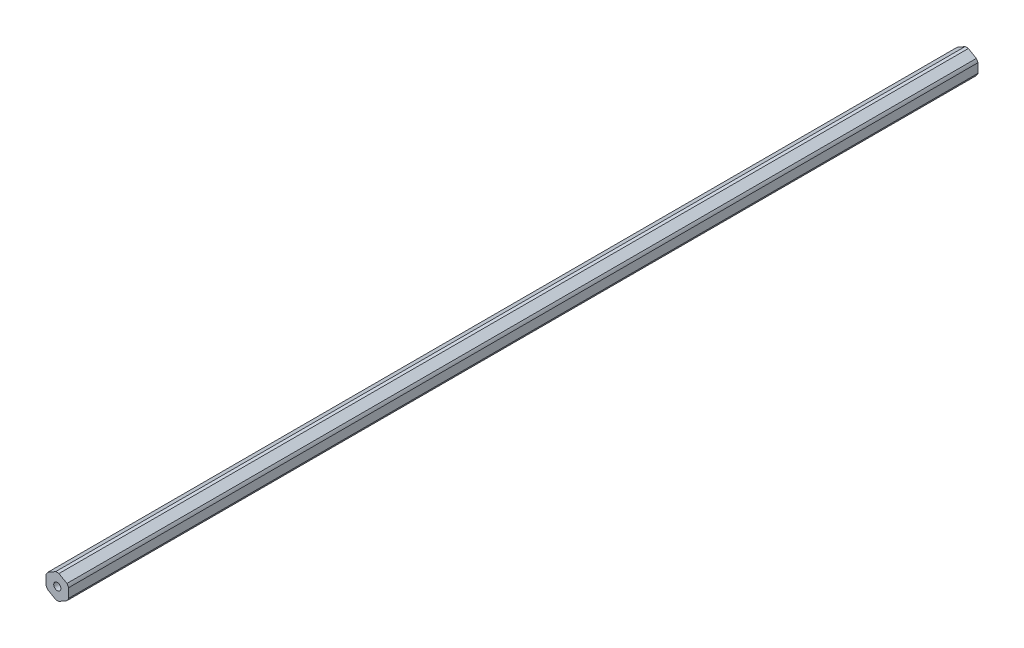
ISO-10303-21;
HEADER;
FILE_DESCRIPTION(('STEP AP214'),'2;1');
FILE_NAME('part.step','',(''),(''),'','','');
FILE_SCHEMA(('AUTOMOTIVE_DESIGN { 1 0 10303 214 1 1 1 1 }'));
ENDSEC;
DATA;
#1=APPLICATION_CONTEXT('core data for automotive mechanical design processes');
#2=APPLICATION_PROTOCOL_DEFINITION('international standard','automotive_design',2000,#1);
#3=PRODUCT_CONTEXT('',#1,'mechanical');
#4=PRODUCT('Part','Part','',(#3));
#5=PRODUCT_RELATED_PRODUCT_CATEGORY('part','',(#4));
#6=PRODUCT_DEFINITION_FORMATION('','',#4);
#7=PRODUCT_DEFINITION_CONTEXT('part definition',#1,'design');
#8=PRODUCT_DEFINITION('design','',#6,#7);
#9=PRODUCT_DEFINITION_SHAPE('','',#8);
#10=(LENGTH_UNIT() NAMED_UNIT(*) SI_UNIT(.MILLI.,.METRE.));
#11=(NAMED_UNIT(*) PLANE_ANGLE_UNIT() SI_UNIT($,.RADIAN.));
#12=(NAMED_UNIT(*) SI_UNIT($,.STERADIAN.) SOLID_ANGLE_UNIT());
#13=UNCERTAINTY_MEASURE_WITH_UNIT(LENGTH_MEASURE(1.E-05),#10,'distance_accuracy_value','');
#14=(GEOMETRIC_REPRESENTATION_CONTEXT(3) GLOBAL_UNCERTAINTY_ASSIGNED_CONTEXT((#13)) GLOBAL_UNIT_ASSIGNED_CONTEXT((#10,
#11,#12)) REPRESENTATION_CONTEXT('',''));
#15=CARTESIAN_POINT('',(0.,0.,0.));
#16=DIRECTION('',(0.,0.,1.));
#17=DIRECTION('',(1.,0.,0.));
#18=AXIS2_PLACEMENT_3D('',#15,#16,#17);
#19=CARTESIAN_POINT('',(6.34999999999999,0.,255.7145));
#20=DIRECTION('',(-1.,0.,0.));
#21=DIRECTION('',(0.,-1.,0.));
#22=AXIS2_PLACEMENT_3D('',#19,#20,#21);
#23=PLANE('',#22);
#24=DIRECTION('',(0.,1.,0.));
#25=VECTOR('',#24,1.);
#26=CARTESIAN_POINT('',(6.34999999999999,0.,-255.7145));
#27=LINE('',#26,#25);
#28=CARTESIAN_POINT('',(6.35000000000002,-2.59030191290508,-255.7145));
#29=VERTEX_POINT('',#28);
#30=CARTESIAN_POINT('',(6.34999999999997,2.59030191290522,-255.7145));
#31=VERTEX_POINT('',#30);
#32=EDGE_CURVE('E173',#29,#31,#27,.T.);
#33=ORIENTED_EDGE('',*,*,#32,.T.);
#34=DIRECTION('',(0.,0.,-1.));
#35=VECTOR('',#34,1.);
#36=CARTESIAN_POINT('',(6.34999999999997,2.59030191290522,255.7145));
#37=LINE('',#36,#35);
#38=CARTESIAN_POINT('',(6.34999999999997,2.59030191290522,255.7145));
#39=VERTEX_POINT('',#38);
#40=EDGE_CURVE('E11',#39,#31,#37,.T.);
#41=ORIENTED_EDGE('',*,*,#40,.F.);
#42=DIRECTION('',(0.,1.,0.));
#43=VECTOR('',#42,1.);
#44=CARTESIAN_POINT('',(6.34999999999999,0.,255.7145));
#45=LINE('',#44,#43);
#46=CARTESIAN_POINT('',(6.35000000000002,-2.59030191290508,255.7145));
#47=VERTEX_POINT('',#46);
#48=EDGE_CURVE('E253',#47,#39,#45,.T.);
#49=ORIENTED_EDGE('',*,*,#48,.F.);
#50=DIRECTION('',(0.,0.,-1.));
#51=VECTOR('',#50,1.);
#52=CARTESIAN_POINT('',(6.35000000000002,-2.59030191290508,255.7145));
#53=LINE('',#52,#51);
#54=EDGE_CURVE('E169',#47,#29,#53,.T.);
#55=ORIENTED_EDGE('',*,*,#54,.T.);
#56=EDGE_LOOP('',(#33,#41,#49,#55));
#57=FACE_BOUND('',#56,.T.);
#58=ADVANCED_FACE('F47',(#57),#23,.F.);
#59=CARTESIAN_POINT('',(0.,0.,255.7145));
#60=DIRECTION('',(0.,0.,-1.));
#61=DIRECTION('',(-1.,0.,0.));
#62=AXIS2_PLACEMENT_3D('',#59,#60,#61);
#63=CYLINDRICAL_SURFACE('',#62,6.858);
#64=CARTESIAN_POINT('',(0.,0.,-255.7145));
#65=DIRECTION('',(0.,0.,1.));
#66=DIRECTION('',(1.,0.,0.));
#67=AXIS2_PLACEMENT_3D('',#64,#65,#66);
#68=CIRCLE('',#67,6.858);
#69=CARTESIAN_POINT('',(5.41826726004722,4.20411035757869,-255.7145));
#70=VERTEX_POINT('',#69);
#71=EDGE_CURVE('E177',#31,#70,#68,.T.);
#72=ORIENTED_EDGE('',*,*,#71,.T.);
#73=DIRECTION('',(0.,0.,-1.));
#74=VECTOR('',#73,1.);
#75=CARTESIAN_POINT('',(5.41826726004722,4.20411035757869,255.7145));
#76=LINE('',#75,#74);
#77=CARTESIAN_POINT('',(5.41826726004722,4.20411035757869,255.7145));
#78=VERTEX_POINT('',#77);
#79=EDGE_CURVE('E56',#78,#70,#76,.T.);
#80=ORIENTED_EDGE('',*,*,#79,.F.);
#81=CARTESIAN_POINT('',(0.,0.,255.7145));
#82=DIRECTION('',(0.,0.,1.));
#83=DIRECTION('',(1.,0.,0.));
#84=AXIS2_PLACEMENT_3D('',#81,#82,#83);
#85=CIRCLE('',#84,6.858);
#86=EDGE_CURVE('E119',#39,#78,#85,.T.);
#87=ORIENTED_EDGE('',*,*,#86,.F.);
#88=ORIENTED_EDGE('',*,*,#40,.T.);
#89=EDGE_LOOP('',(#72,#80,#87,#88));
#90=FACE_BOUND('',#89,.T.);
#91=ADVANCED_FACE('F297',(#90),#63,.T.);
#92=CARTESIAN_POINT('',(3.17499999999998,5.49926131403122,255.7145));
#93=DIRECTION('',(-0.499999999999995,-0.866025403784442,0.));
#94=DIRECTION('',(0.866025403784442,-0.499999999999995,0.));
#95=AXIS2_PLACEMENT_3D('',#92,#93,#94);
#96=PLANE('',#95);
#97=DIRECTION('',(-0.866025403784442,0.499999999999995,0.));
#98=VECTOR('',#97,1.);
#99=CARTESIAN_POINT('',(3.17499999999998,5.49926131403122,-255.7145));
#100=LINE('',#99,#98);
#101=CARTESIAN_POINT('',(0.931732739952741,6.79441227048375,-255.7145));
#102=VERTEX_POINT('',#101);
#103=EDGE_CURVE('E181',#70,#102,#100,.T.);
#104=ORIENTED_EDGE('',*,*,#103,.T.);
#105=DIRECTION('',(0.,0.,-1.));
#106=VECTOR('',#105,1.);
#107=CARTESIAN_POINT('',(0.931732739952741,6.79441227048375,255.7145));
#108=LINE('',#107,#106);
#109=CARTESIAN_POINT('',(0.931732739952741,6.79441227048375,255.7145));
#110=VERTEX_POINT('',#109);
#111=EDGE_CURVE('E224',#110,#102,#108,.T.);
#112=ORIENTED_EDGE('',*,*,#111,.F.);
#113=DIRECTION('',(-0.866025403784442,0.499999999999995,0.));
#114=VECTOR('',#113,1.);
#115=CARTESIAN_POINT('',(3.17499999999998,5.49926131403122,255.7145));
#116=LINE('',#115,#114);
#117=EDGE_CURVE('E234',#78,#110,#116,.T.);
#118=ORIENTED_EDGE('',*,*,#117,.F.);
#119=ORIENTED_EDGE('',*,*,#79,.T.);
#120=EDGE_LOOP('',(#104,#112,#118,#119));
#121=FACE_BOUND('',#120,.T.);
#122=ADVANCED_FACE('F232',(#121),#96,.F.);
#123=CARTESIAN_POINT('',(-0.931732739952726,6.79441227048375,-255.7145));
#124=VERTEX_POINT('',#123);
#125=EDGE_CURVE('E182',#102,#124,#68,.T.);
#126=ORIENTED_EDGE('',*,*,#125,.T.);
#127=DIRECTION('',(0.,0.,-1.));
#128=VECTOR('',#127,1.);
#129=CARTESIAN_POINT('',(-0.931732739952726,6.79441227048375,255.7145));
#130=LINE('',#129,#128);
#131=CARTESIAN_POINT('',(-0.931732739952726,6.79441227048375,255.7145));
#132=VERTEX_POINT('',#131);
#133=EDGE_CURVE('E220',#132,#124,#130,.T.);
#134=ORIENTED_EDGE('',*,*,#133,.F.);
#135=EDGE_CURVE('E259',#110,#132,#85,.T.);
#136=ORIENTED_EDGE('',*,*,#135,.F.);
#137=ORIENTED_EDGE('',*,*,#111,.T.);
#138=EDGE_LOOP('',(#126,#134,#136,#137));
#139=FACE_BOUND('',#138,.T.);
#140=ADVANCED_FACE('F280',(#139),#63,.T.);
#141=CARTESIAN_POINT('',(-3.175,5.49926131403118,255.7145));
#142=DIRECTION('',(0.500000000000001,-0.866025403784438,0.));
#143=DIRECTION('',(0.866025403784438,0.500000000000001,0.));
#144=AXIS2_PLACEMENT_3D('',#141,#142,#143);
#145=PLANE('',#144);
#146=DIRECTION('',(-0.866025403784438,-0.500000000000001,0.));
#147=VECTOR('',#146,1.);
#148=CARTESIAN_POINT('',(-3.175,5.49926131403118,-255.7145));
#149=LINE('',#148,#147);
#150=CARTESIAN_POINT('',(-5.41826726004728,4.2041103575786,-255.7145));
#151=VERTEX_POINT('',#150);
#152=EDGE_CURVE('E185',#124,#151,#149,.T.);
#153=ORIENTED_EDGE('',*,*,#152,.T.);
#154=DIRECTION('',(0.,0.,-1.));
#155=VECTOR('',#154,1.);
#156=CARTESIAN_POINT('',(-5.41826726004728,4.2041103575786,255.7145));
#157=LINE('',#156,#155);
#158=CARTESIAN_POINT('',(-5.41826726004728,4.2041103575786,255.7145));
#159=VERTEX_POINT('',#158);
#160=EDGE_CURVE('E216',#159,#151,#157,.T.);
#161=ORIENTED_EDGE('',*,*,#160,.F.);
#162=DIRECTION('',(-0.866025403784438,-0.500000000000001,0.));
#163=VECTOR('',#162,1.);
#164=CARTESIAN_POINT('',(-3.175,5.49926131403118,255.7145));
#165=LINE('',#164,#163);
#166=EDGE_CURVE('E266',#132,#159,#165,.T.);
#167=ORIENTED_EDGE('',*,*,#166,.F.);
#168=ORIENTED_EDGE('',*,*,#133,.T.);
#169=EDGE_LOOP('',(#153,#161,#167,#168));
#170=FACE_BOUND('',#169,.T.);
#171=ADVANCED_FACE('F282',(#170),#145,.F.);
#172=CARTESIAN_POINT('',(-6.35,2.59030191290512,-255.7145));
#173=VERTEX_POINT('',#172);
#174=EDGE_CURVE('E188',#151,#173,#68,.T.);
#175=ORIENTED_EDGE('',*,*,#174,.T.);
#176=DIRECTION('',(0.,0.,-1.));
#177=VECTOR('',#176,1.);
#178=CARTESIAN_POINT('',(-6.35,2.59030191290512,255.7145));
#179=LINE('',#178,#177);
#180=CARTESIAN_POINT('',(-6.35,2.59030191290512,255.7145));
#181=VERTEX_POINT('',#180);
#182=EDGE_CURVE('E212',#181,#173,#179,.T.);
#183=ORIENTED_EDGE('',*,*,#182,.F.);
#184=EDGE_CURVE('E268',#159,#181,#85,.T.);
#185=ORIENTED_EDGE('',*,*,#184,.F.);
#186=ORIENTED_EDGE('',*,*,#160,.T.);
#187=EDGE_LOOP('',(#175,#183,#185,#186));
#188=FACE_BOUND('',#187,.T.);
#189=ADVANCED_FACE('F283',(#188),#63,.T.);
#190=CARTESIAN_POINT('',(-6.35,0.,255.7145));
#191=DIRECTION('',(1.,0.,0.));
#192=DIRECTION('',(0.,1.,0.));
#193=AXIS2_PLACEMENT_3D('',#190,#191,#192);
#194=PLANE('',#193);
#195=DIRECTION('',(0.,-1.,0.));
#196=VECTOR('',#195,1.);
#197=CARTESIAN_POINT('',(-6.35,0.,-255.7145));
#198=LINE('',#197,#196);
#199=CARTESIAN_POINT('',(-6.34999999999999,-2.59030191290517,-255.7145));
#200=VERTEX_POINT('',#199);
#201=EDGE_CURVE('E189',#173,#200,#198,.T.);
#202=ORIENTED_EDGE('',*,*,#201,.T.);
#203=DIRECTION('',(0.,0.,-1.));
#204=VECTOR('',#203,1.);
#205=CARTESIAN_POINT('',(-6.34999999999999,-2.59030191290517,255.7145));
#206=LINE('',#205,#204);
#207=CARTESIAN_POINT('',(-6.34999999999999,-2.59030191290517,255.7145));
#208=VERTEX_POINT('',#207);
#209=EDGE_CURVE('E208',#208,#200,#206,.T.);
#210=ORIENTED_EDGE('',*,*,#209,.F.);
#211=DIRECTION('',(0.,-1.,0.));
#212=VECTOR('',#211,1.);
#213=CARTESIAN_POINT('',(-6.35,0.,255.7145));
#214=LINE('',#213,#212);
#215=EDGE_CURVE('E269',#181,#208,#214,.T.);
#216=ORIENTED_EDGE('',*,*,#215,.F.);
#217=ORIENTED_EDGE('',*,*,#182,.T.);
#218=EDGE_LOOP('',(#202,#210,#216,#217));
#219=FACE_BOUND('',#218,.T.);
#220=ADVANCED_FACE('F286',(#219),#194,.F.);
#221=CARTESIAN_POINT('',(-5.41826726004726,-4.20411035757864,-255.7145));
#222=VERTEX_POINT('',#221);
#223=EDGE_CURVE('E192',#200,#222,#68,.T.);
#224=ORIENTED_EDGE('',*,*,#223,.T.);
#225=DIRECTION('',(0.,0.,-1.));
#226=VECTOR('',#225,1.);
#227=CARTESIAN_POINT('',(-5.41826726004726,-4.20411035757864,255.7145));
#228=LINE('',#227,#226);
#229=CARTESIAN_POINT('',(-5.41826726004726,-4.20411035757864,255.7145));
#230=VERTEX_POINT('',#229);
#231=EDGE_CURVE('E204',#230,#222,#228,.T.);
#232=ORIENTED_EDGE('',*,*,#231,.F.);
#233=EDGE_CURVE('E156',#208,#230,#85,.T.);
#234=ORIENTED_EDGE('',*,*,#233,.F.);
#235=ORIENTED_EDGE('',*,*,#209,.T.);
#236=EDGE_LOOP('',(#224,#232,#234,#235));
#237=FACE_BOUND('',#236,.T.);
#238=ADVANCED_FACE('F288',(#237),#63,.T.);
#239=CARTESIAN_POINT('',(-3.17499999999997,-5.4992613140312,255.7145));
#240=DIRECTION('',(0.499999999999995,0.866025403784442,0.));
#241=DIRECTION('',(-0.866025403784442,0.499999999999995,0.));
#242=AXIS2_PLACEMENT_3D('',#239,#240,#241);
#243=PLANE('',#242);
#244=DIRECTION('',(0.866025403784442,-0.499999999999995,0.));
#245=VECTOR('',#244,1.);
#246=CARTESIAN_POINT('',(-3.17499999999997,-5.4992613140312,-255.7145));
#247=LINE('',#246,#245);
#248=CARTESIAN_POINT('',(-0.931732739952676,-6.79441227048376,-255.7145));
#249=VERTEX_POINT('',#248);
#250=EDGE_CURVE('E193',#222,#249,#247,.T.);
#251=ORIENTED_EDGE('',*,*,#250,.T.);
#252=DIRECTION('',(0.,0.,-1.));
#253=VECTOR('',#252,1.);
#254=CARTESIAN_POINT('',(-0.931732739952676,-6.79441227048376,255.7145));
#255=LINE('',#254,#253);
#256=CARTESIAN_POINT('',(-0.931732739952676,-6.79441227048376,255.7145));
#257=VERTEX_POINT('',#256);
#258=EDGE_CURVE('E162',#257,#249,#255,.T.);
#259=ORIENTED_EDGE('',*,*,#258,.F.);
#260=DIRECTION('',(0.866025403784442,-0.499999999999995,0.));
#261=VECTOR('',#260,1.);
#262=CARTESIAN_POINT('',(-3.17499999999997,-5.4992613140312,255.7145));
#263=LINE('',#262,#261);
#264=EDGE_CURVE('E150',#230,#257,#263,.T.);
#265=ORIENTED_EDGE('',*,*,#264,.F.);
#266=ORIENTED_EDGE('',*,*,#231,.T.);
#267=EDGE_LOOP('',(#251,#259,#265,#266));
#268=FACE_BOUND('',#267,.T.);
#269=ADVANCED_FACE('F291',(#268),#243,.F.);
#270=CARTESIAN_POINT('',(0.931732739952771,-6.79441227048375,-255.7145));
#271=VERTEX_POINT('',#270);
#272=EDGE_CURVE('E160',#249,#271,#68,.T.);
#273=ORIENTED_EDGE('',*,*,#272,.T.);
#274=DIRECTION('',(0.,0.,-1.));
#275=VECTOR('',#274,1.);
#276=CARTESIAN_POINT('',(0.931732739952771,-6.79441227048375,255.7145));
#277=LINE('',#276,#275);
#278=CARTESIAN_POINT('',(0.931732739952771,-6.79441227048375,255.7145));
#279=VERTEX_POINT('',#278);
#280=EDGE_CURVE('E157',#279,#271,#277,.T.);
#281=ORIENTED_EDGE('',*,*,#280,.F.);
#282=EDGE_CURVE('E144',#257,#279,#85,.T.);
#283=ORIENTED_EDGE('',*,*,#282,.F.);
#284=ORIENTED_EDGE('',*,*,#258,.T.);
#285=EDGE_LOOP('',(#273,#281,#283,#284));
#286=FACE_BOUND('',#285,.T.);
#287=ADVANCED_FACE('F158',(#286),#63,.T.);
#288=CARTESIAN_POINT('',(3.17500000000004,-5.49926131403116,255.7145));
#289=DIRECTION('',(-0.500000000000007,0.866025403784434,0.));
#290=DIRECTION('',(-0.866025403784435,-0.500000000000007,0.));
#291=AXIS2_PLACEMENT_3D('',#288,#289,#290);
#292=PLANE('',#291);
#293=DIRECTION('',(0.866025403784435,0.500000000000007,0.));
#294=VECTOR('',#293,1.);
#295=CARTESIAN_POINT('',(3.17500000000004,-5.49926131403116,-255.7145));
#296=LINE('',#295,#294);
#297=CARTESIAN_POINT('',(5.41826726004732,-4.20411035757857,-255.7145));
#298=VERTEX_POINT('',#297);
#299=EDGE_CURVE('E105',#271,#298,#296,.T.);
#300=ORIENTED_EDGE('',*,*,#299,.T.);
#301=DIRECTION('',(0.,0.,-1.));
#302=VECTOR('',#301,1.);
#303=CARTESIAN_POINT('',(5.41826726004732,-4.20411035757857,255.7145));
#304=LINE('',#303,#302);
#305=CARTESIAN_POINT('',(5.41826726004732,-4.20411035757857,255.7145));
#306=VERTEX_POINT('',#305);
#307=EDGE_CURVE('E163',#306,#298,#304,.T.);
#308=ORIENTED_EDGE('',*,*,#307,.F.);
#309=DIRECTION('',(0.866025403784435,0.500000000000007,0.));
#310=VECTOR('',#309,1.);
#311=CARTESIAN_POINT('',(3.17500000000004,-5.49926131403116,255.7145));
#312=LINE('',#311,#310);
#313=EDGE_CURVE('E148',#279,#306,#312,.T.);
#314=ORIENTED_EDGE('',*,*,#313,.F.);
#315=ORIENTED_EDGE('',*,*,#280,.T.);
#316=EDGE_LOOP('',(#300,#308,#314,#315));
#317=FACE_BOUND('',#316,.T.);
#318=ADVANCED_FACE('F165',(#317),#292,.F.);
#319=EDGE_CURVE('E111',#298,#29,#68,.T.);
#320=ORIENTED_EDGE('',*,*,#319,.T.);
#321=ORIENTED_EDGE('',*,*,#54,.F.);
#322=EDGE_CURVE('E64',#306,#47,#85,.T.);
#323=ORIENTED_EDGE('',*,*,#322,.F.);
#324=ORIENTED_EDGE('',*,*,#307,.T.);
#325=EDGE_LOOP('',(#320,#321,#323,#324));
#326=FACE_BOUND('',#325,.T.);
#327=ADVANCED_FACE('F294',(#326),#63,.T.);
#328=CARTESIAN_POINT('',(0.,0.,255.7145));
#329=DIRECTION('',(0.,0.,1.));
#330=DIRECTION('',(1.,0.,0.));
#331=AXIS2_PLACEMENT_3D('',#328,#329,#330);
#332=PLANE('',#331);
#333=CARTESIAN_POINT('',(0.,0.,255.7145));
#334=DIRECTION('',(0.,0.,1.));
#335=DIRECTION('',(1.,0.,0.));
#336=AXIS2_PLACEMENT_3D('',#333,#334,#335);
#337=CIRCLE('',#336,2.0193);
#338=CARTESIAN_POINT('',(2.0193,0.,255.7145));
#339=VERTEX_POINT('',#338);
#340=EDGE_CURVE('E261',#339,#339,#337,.T.);
#341=ORIENTED_EDGE('',*,*,#340,.F.);
#342=EDGE_LOOP('',(#341));
#343=FACE_BOUND('',#342,.T.);
#344=ORIENTED_EDGE('',*,*,#48,.T.);
#345=ORIENTED_EDGE('',*,*,#86,.T.);
#346=ORIENTED_EDGE('',*,*,#117,.T.);
#347=ORIENTED_EDGE('',*,*,#135,.T.);
#348=ORIENTED_EDGE('',*,*,#166,.T.);
#349=ORIENTED_EDGE('',*,*,#184,.T.);
#350=ORIENTED_EDGE('',*,*,#215,.T.);
#351=ORIENTED_EDGE('',*,*,#233,.T.);
#352=ORIENTED_EDGE('',*,*,#264,.T.);
#353=ORIENTED_EDGE('',*,*,#282,.T.);
#354=ORIENTED_EDGE('',*,*,#313,.T.);
#355=ORIENTED_EDGE('',*,*,#322,.T.);
#356=EDGE_LOOP('',(#344,#345,#346,#347,#348,#349,#350,#351,#352,#353,#354,#355));
#357=FACE_BOUND('',#356,.T.);
#358=ADVANCED_FACE('F146',(#343,#357),#332,.T.);
#359=CARTESIAN_POINT('',(0.,0.,-255.7145));
#360=DIRECTION('',(0.,0.,1.));
#361=DIRECTION('',(1.,0.,0.));
#362=AXIS2_PLACEMENT_3D('',#359,#360,#361);
#363=PLANE('',#362);
#364=CARTESIAN_POINT('',(0.,0.,-255.7145));
#365=DIRECTION('',(0.,0.,1.));
#366=DIRECTION('',(1.,0.,0.));
#367=AXIS2_PLACEMENT_3D('',#364,#365,#366);
#368=CIRCLE('',#367,2.0193);
#369=CARTESIAN_POINT('',(2.0193,0.,-255.7145));
#370=VERTEX_POINT('',#369);
#371=EDGE_CURVE('E178',#370,#370,#368,.T.);
#372=ORIENTED_EDGE('',*,*,#371,.T.);
#373=EDGE_LOOP('',(#372));
#374=FACE_BOUND('',#373,.T.);
#375=ORIENTED_EDGE('',*,*,#32,.F.);
#376=ORIENTED_EDGE('',*,*,#319,.F.);
#377=ORIENTED_EDGE('',*,*,#299,.F.);
#378=ORIENTED_EDGE('',*,*,#272,.F.);
#379=ORIENTED_EDGE('',*,*,#250,.F.);
#380=ORIENTED_EDGE('',*,*,#223,.F.);
#381=ORIENTED_EDGE('',*,*,#201,.F.);
#382=ORIENTED_EDGE('',*,*,#174,.F.);
#383=ORIENTED_EDGE('',*,*,#152,.F.);
#384=ORIENTED_EDGE('',*,*,#125,.F.);
#385=ORIENTED_EDGE('',*,*,#103,.F.);
#386=ORIENTED_EDGE('',*,*,#71,.F.);
#387=EDGE_LOOP('',(#375,#376,#377,#378,#379,#380,#381,#382,#383,#384,#385,#386));
#388=FACE_BOUND('',#387,.T.);
#389=ADVANCED_FACE('F238',(#374,#388),#363,.F.);
#390=CARTESIAN_POINT('',(0.,0.,-255.7145));
#391=DIRECTION('',(0.,0.,1.));
#392=DIRECTION('',(1.,0.,0.));
#393=AXIS2_PLACEMENT_3D('',#390,#391,#392);
#394=CYLINDRICAL_SURFACE('',#393,2.0193);
#395=ORIENTED_EDGE('',*,*,#371,.F.);
#396=EDGE_LOOP('',(#395));
#397=FACE_BOUND('',#396,.T.);
#398=ORIENTED_EDGE('',*,*,#340,.T.);
#399=EDGE_LOOP('',(#398));
#400=FACE_BOUND('',#399,.T.);
#401=ADVANCED_FACE('F391',(#397,#400),#394,.F.);
#402=CLOSED_SHELL('',(#58,#91,#122,#140,#171,#189,#220,#238,#269,#287,#318,#327,#358,#389,#401));
#403=MANIFOLD_SOLID_BREP('B2',#402);
#404=ADVANCED_BREP_SHAPE_REPRESENTATION('',(#18,#403),#14);
#405=SHAPE_DEFINITION_REPRESENTATION(#9,#404);
ENDSEC;
END-ISO-10303-21;
